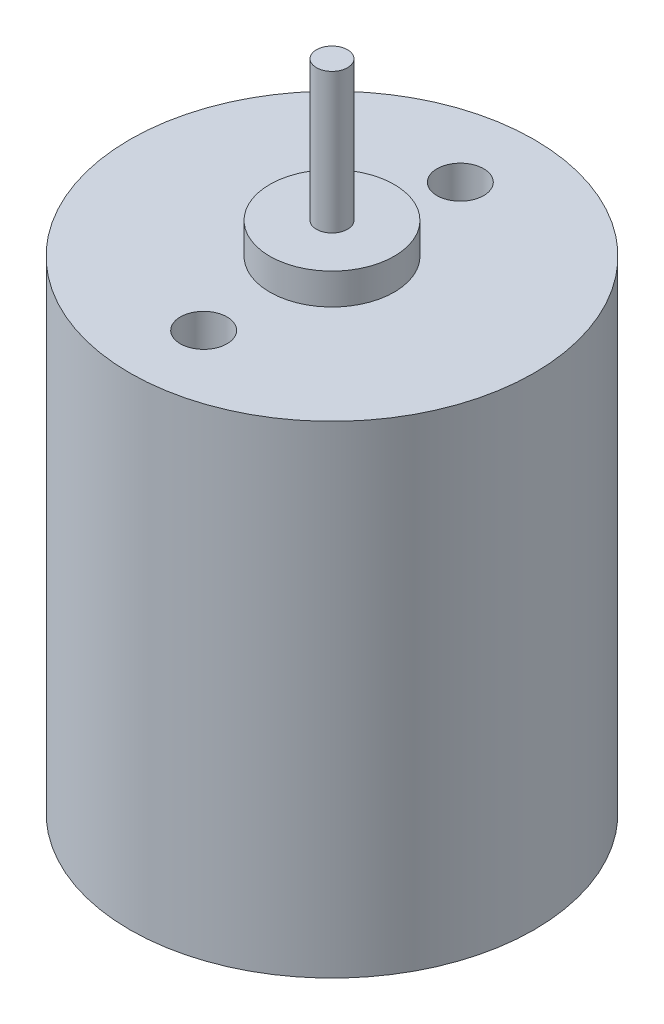
ISO-10303-21;
HEADER;
FILE_DESCRIPTION(('STEP AP214'),'2;1');
FILE_NAME('part.step','',(''),(''),'','','');
FILE_SCHEMA(('AUTOMOTIVE_DESIGN { 1 0 10303 214 1 1 1 1 }'));
ENDSEC;
DATA;
#1=APPLICATION_CONTEXT('core data for automotive mechanical design processes');
#2=APPLICATION_PROTOCOL_DEFINITION('international standard','automotive_design',2000,#1);
#3=PRODUCT_CONTEXT('',#1,'mechanical');
#4=PRODUCT('Part','Part','',(#3));
#5=PRODUCT_RELATED_PRODUCT_CATEGORY('part','',(#4));
#6=PRODUCT_DEFINITION_FORMATION('','',#4);
#7=PRODUCT_DEFINITION_CONTEXT('part definition',#1,'design');
#8=PRODUCT_DEFINITION('design','',#6,#7);
#9=PRODUCT_DEFINITION_SHAPE('','',#8);
#10=(LENGTH_UNIT() NAMED_UNIT(*) SI_UNIT(.MILLI.,.METRE.));
#11=(NAMED_UNIT(*) PLANE_ANGLE_UNIT() SI_UNIT($,.RADIAN.));
#12=(NAMED_UNIT(*) SI_UNIT($,.STERADIAN.) SOLID_ANGLE_UNIT());
#13=UNCERTAINTY_MEASURE_WITH_UNIT(LENGTH_MEASURE(1.E-05),#10,'distance_accuracy_value','');
#14=(GEOMETRIC_REPRESENTATION_CONTEXT(3) GLOBAL_UNCERTAINTY_ASSIGNED_CONTEXT((#13)) GLOBAL_UNIT_ASSIGNED_CONTEXT((#10,
#11,#12)) REPRESENTATION_CONTEXT('',''));
#15=CARTESIAN_POINT('',(0.,0.,0.));
#16=DIRECTION('',(0.,0.,1.));
#17=DIRECTION('',(1.,0.,0.));
#18=AXIS2_PLACEMENT_3D('',#15,#16,#17);
#19=CARTESIAN_POINT('',(0.,31.,0.));
#20=DIRECTION('',(0.,-1.,0.));
#21=DIRECTION('',(0.,0.,-1.));
#22=AXIS2_PLACEMENT_3D('',#19,#20,#21);
#23=CYLINDRICAL_SURFACE('',#22,13.);
#24=CARTESIAN_POINT('',(0.,31.,0.));
#25=DIRECTION('',(0.,1.,0.));
#26=DIRECTION('',(0.,0.,1.));
#27=AXIS2_PLACEMENT_3D('',#24,#25,#26);
#28=CIRCLE('',#27,13.);
#29=CARTESIAN_POINT('',(0.,31.,13.));
#30=VERTEX_POINT('',#29);
#31=EDGE_CURVE('E10',#30,#30,#28,.T.);
#32=ORIENTED_EDGE('',*,*,#31,.F.);
#33=EDGE_LOOP('',(#32));
#34=FACE_BOUND('',#33,.T.);
#35=CARTESIAN_POINT('',(0.,0.,0.));
#36=DIRECTION('',(0.,1.,0.));
#37=DIRECTION('',(0.,0.,1.));
#38=AXIS2_PLACEMENT_3D('',#35,#36,#37);
#39=CIRCLE('',#38,13.);
#40=CARTESIAN_POINT('',(0.,0.,13.));
#41=VERTEX_POINT('',#40);
#42=EDGE_CURVE('E34',#41,#41,#39,.T.);
#43=ORIENTED_EDGE('',*,*,#42,.T.);
#44=EDGE_LOOP('',(#43));
#45=FACE_BOUND('',#44,.T.);
#46=ADVANCED_FACE('F31',(#34,#45),#23,.T.);
#47=CARTESIAN_POINT('',(0.,31.,0.));
#48=DIRECTION('',(0.,1.,0.));
#49=DIRECTION('',(0.,0.,1.));
#50=AXIS2_PLACEMENT_3D('',#47,#48,#49);
#51=PLANE('',#50);
#52=CARTESIAN_POINT('',(0.,31.,-8.25));
#53=DIRECTION('',(0.,1.,0.));
#54=DIRECTION('',(0.,0.,1.));
#55=AXIS2_PLACEMENT_3D('',#52,#53,#54);
#56=CIRCLE('',#55,1.5);
#57=CARTESIAN_POINT('',(0.,31.,-6.75));
#58=VERTEX_POINT('',#57);
#59=EDGE_CURVE('E61',#58,#58,#56,.T.);
#60=ORIENTED_EDGE('',*,*,#59,.F.);
#61=EDGE_LOOP('',(#60));
#62=FACE_BOUND('',#61,.T.);
#63=CARTESIAN_POINT('',(0.,31.,8.25));
#64=DIRECTION('',(0.,1.,0.));
#65=DIRECTION('',(0.,0.,1.));
#66=AXIS2_PLACEMENT_3D('',#63,#64,#65);
#67=CIRCLE('',#66,1.5);
#68=CARTESIAN_POINT('',(0.,31.,9.75));
#69=VERTEX_POINT('',#68);
#70=EDGE_CURVE('E55',#69,#69,#67,.T.);
#71=ORIENTED_EDGE('',*,*,#70,.F.);
#72=EDGE_LOOP('',(#71));
#73=FACE_BOUND('',#72,.T.);
#74=CARTESIAN_POINT('',(0.,31.,0.));
#75=DIRECTION('',(0.,1.,0.));
#76=DIRECTION('',(0.,0.,1.));
#77=AXIS2_PLACEMENT_3D('',#74,#75,#76);
#78=CIRCLE('',#77,4.);
#79=CARTESIAN_POINT('',(0.,31.,4.));
#80=VERTEX_POINT('',#79);
#81=EDGE_CURVE('E43',#80,#80,#78,.T.);
#82=ORIENTED_EDGE('',*,*,#81,.F.);
#83=EDGE_LOOP('',(#82));
#84=FACE_BOUND('',#83,.T.);
#85=ORIENTED_EDGE('',*,*,#31,.T.);
#86=EDGE_LOOP('',(#85));
#87=FACE_BOUND('',#86,.T.);
#88=ADVANCED_FACE('F76',(#62,#73,#84,#87),#51,.T.);
#89=CARTESIAN_POINT('',(0.,0.,0.));
#90=DIRECTION('',(0.,1.,0.));
#91=DIRECTION('',(0.,0.,1.));
#92=AXIS2_PLACEMENT_3D('',#89,#90,#91);
#93=PLANE('',#92);
#94=ORIENTED_EDGE('',*,*,#42,.F.);
#95=EDGE_LOOP('',(#94));
#96=FACE_BOUND('',#95,.T.);
#97=ADVANCED_FACE('F79',(#96),#93,.F.);
#98=CARTESIAN_POINT('',(0.,33.,0.));
#99=DIRECTION('',(0.,-1.,0.));
#100=DIRECTION('',(0.,0.,-1.));
#101=AXIS2_PLACEMENT_3D('',#98,#99,#100);
#102=CYLINDRICAL_SURFACE('',#101,4.);
#103=CARTESIAN_POINT('',(0.,33.,0.));
#104=DIRECTION('',(0.,1.,0.));
#105=DIRECTION('',(0.,0.,1.));
#106=AXIS2_PLACEMENT_3D('',#103,#104,#105);
#107=CIRCLE('',#106,4.);
#108=CARTESIAN_POINT('',(0.,33.,4.));
#109=VERTEX_POINT('',#108);
#110=EDGE_CURVE('E41',#109,#109,#107,.T.);
#111=ORIENTED_EDGE('',*,*,#110,.F.);
#112=EDGE_LOOP('',(#111));
#113=FACE_BOUND('',#112,.T.);
#114=ORIENTED_EDGE('',*,*,#81,.T.);
#115=EDGE_LOOP('',(#114));
#116=FACE_BOUND('',#115,.T.);
#117=ADVANCED_FACE('F85',(#113,#116),#102,.T.);
#118=CARTESIAN_POINT('',(0.,33.,0.));
#119=DIRECTION('',(0.,1.,0.));
#120=DIRECTION('',(0.,0.,1.));
#121=AXIS2_PLACEMENT_3D('',#118,#119,#120);
#122=PLANE('',#121);
#123=CARTESIAN_POINT('',(0.,33.,0.));
#124=DIRECTION('',(0.,1.,0.));
#125=DIRECTION('',(0.,0.,1.));
#126=AXIS2_PLACEMENT_3D('',#123,#124,#125);
#127=CIRCLE('',#126,1.);
#128=CARTESIAN_POINT('',(0.,33.,1.));
#129=VERTEX_POINT('',#128);
#130=EDGE_CURVE('E49',#129,#129,#127,.T.);
#131=ORIENTED_EDGE('',*,*,#130,.F.);
#132=EDGE_LOOP('',(#131));
#133=FACE_BOUND('',#132,.T.);
#134=ORIENTED_EDGE('',*,*,#110,.T.);
#135=EDGE_LOOP('',(#134));
#136=FACE_BOUND('',#135,.T.);
#137=ADVANCED_FACE('F87',(#133,#136),#122,.T.);
#138=CARTESIAN_POINT('',(0.,42.,0.));
#139=DIRECTION('',(0.,-1.,0.));
#140=DIRECTION('',(0.,0.,-1.));
#141=AXIS2_PLACEMENT_3D('',#138,#139,#140);
#142=CYLINDRICAL_SURFACE('',#141,1.);
#143=CARTESIAN_POINT('',(0.,42.,0.));
#144=DIRECTION('',(0.,1.,0.));
#145=DIRECTION('',(0.,0.,1.));
#146=AXIS2_PLACEMENT_3D('',#143,#144,#145);
#147=CIRCLE('',#146,1.);
#148=CARTESIAN_POINT('',(0.,42.,1.));
#149=VERTEX_POINT('',#148);
#150=EDGE_CURVE('E46',#149,#149,#147,.T.);
#151=ORIENTED_EDGE('',*,*,#150,.F.);
#152=EDGE_LOOP('',(#151));
#153=FACE_BOUND('',#152,.T.);
#154=ORIENTED_EDGE('',*,*,#130,.T.);
#155=EDGE_LOOP('',(#154));
#156=FACE_BOUND('',#155,.T.);
#157=ADVANCED_FACE('F94',(#153,#156),#142,.T.);
#158=CARTESIAN_POINT('',(0.,42.,0.));
#159=DIRECTION('',(0.,1.,0.));
#160=DIRECTION('',(0.,0.,1.));
#161=AXIS2_PLACEMENT_3D('',#158,#159,#160);
#162=PLANE('',#161);
#163=ORIENTED_EDGE('',*,*,#150,.T.);
#164=EDGE_LOOP('',(#163));
#165=FACE_BOUND('',#164,.T.);
#166=ADVANCED_FACE('F133',(#165),#162,.T.);
#167=CARTESIAN_POINT('',(0.,26.,8.25));
#168=DIRECTION('',(0.,1.,0.));
#169=DIRECTION('',(0.,0.,1.));
#170=AXIS2_PLACEMENT_3D('',#167,#168,#169);
#171=CYLINDRICAL_SURFACE('',#170,1.5);
#172=CARTESIAN_POINT('',(0.,26.,8.25));
#173=DIRECTION('',(0.,1.,0.));
#174=DIRECTION('',(0.,0.,1.));
#175=AXIS2_PLACEMENT_3D('',#172,#173,#174);
#176=CIRCLE('',#175,1.5);
#177=CARTESIAN_POINT('',(0.,26.,9.75));
#178=VERTEX_POINT('',#177);
#179=EDGE_CURVE('E52',#178,#178,#176,.T.);
#180=ORIENTED_EDGE('',*,*,#179,.F.);
#181=EDGE_LOOP('',(#180));
#182=FACE_BOUND('',#181,.T.);
#183=ORIENTED_EDGE('',*,*,#70,.T.);
#184=EDGE_LOOP('',(#183));
#185=FACE_BOUND('',#184,.T.);
#186=ADVANCED_FACE('F142',(#182,#185),#171,.F.);
#187=CARTESIAN_POINT('',(0.,26.,8.25));
#188=DIRECTION('',(0.,1.,0.));
#189=DIRECTION('',(0.,0.,1.));
#190=AXIS2_PLACEMENT_3D('',#187,#188,#189);
#191=PLANE('',#190);
#192=ORIENTED_EDGE('',*,*,#179,.T.);
#193=EDGE_LOOP('',(#192));
#194=FACE_BOUND('',#193,.T.);
#195=ADVANCED_FACE('F72',(#194),#191,.T.);
#196=CARTESIAN_POINT('',(0.,26.,-8.25));
#197=DIRECTION('',(0.,1.,0.));
#198=DIRECTION('',(0.,0.,1.));
#199=AXIS2_PLACEMENT_3D('',#196,#197,#198);
#200=CYLINDRICAL_SURFACE('',#199,1.5);
#201=CARTESIAN_POINT('',(0.,26.,-8.25));
#202=DIRECTION('',(0.,1.,0.));
#203=DIRECTION('',(0.,0.,1.));
#204=AXIS2_PLACEMENT_3D('',#201,#202,#203);
#205=CIRCLE('',#204,1.5);
#206=CARTESIAN_POINT('',(0.,26.,-6.75));
#207=VERTEX_POINT('',#206);
#208=EDGE_CURVE('E58',#207,#207,#205,.T.);
#209=ORIENTED_EDGE('',*,*,#208,.F.);
#210=EDGE_LOOP('',(#209));
#211=FACE_BOUND('',#210,.T.);
#212=ORIENTED_EDGE('',*,*,#59,.T.);
#213=EDGE_LOOP('',(#212));
#214=FACE_BOUND('',#213,.T.);
#215=ADVANCED_FACE('F69',(#211,#214),#200,.F.);
#216=CARTESIAN_POINT('',(0.,26.,-8.25));
#217=DIRECTION('',(0.,1.,0.));
#218=DIRECTION('',(0.,0.,1.));
#219=AXIS2_PLACEMENT_3D('',#216,#217,#218);
#220=PLANE('',#219);
#221=ORIENTED_EDGE('',*,*,#208,.T.);
#222=EDGE_LOOP('',(#221));
#223=FACE_BOUND('',#222,.T.);
#224=ADVANCED_FACE('F67',(#223),#220,.T.);
#225=CLOSED_SHELL('',(#46,#88,#97,#117,#137,#157,#166,#186,#195,#215,#224));
#226=MANIFOLD_SOLID_BREP('B2',#225);
#227=ADVANCED_BREP_SHAPE_REPRESENTATION('',(#18,#226),#14);
#228=SHAPE_DEFINITION_REPRESENTATION(#9,#227);
ENDSEC;
END-ISO-10303-21;
